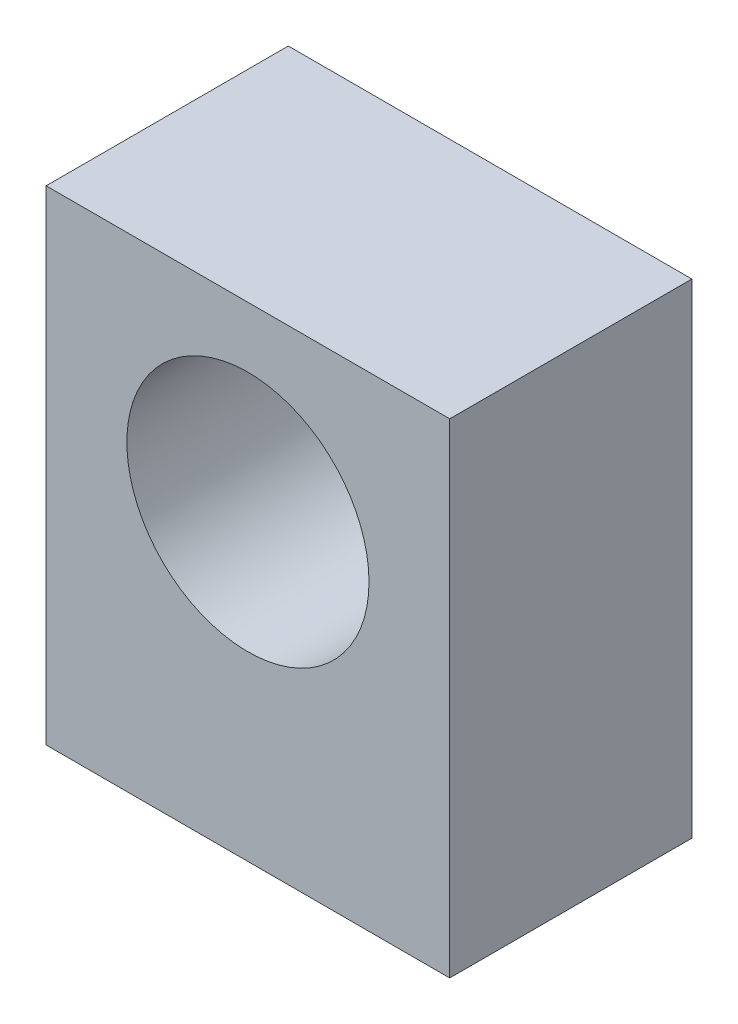
ISO-10303-21;
HEADER;
FILE_DESCRIPTION(('STEP AP214'),'2;1');
FILE_NAME('part.step','',(''),(''),'','','');
FILE_SCHEMA(('AUTOMOTIVE_DESIGN { 1 0 10303 214 1 1 1 1 }'));
ENDSEC;
DATA;
#1=APPLICATION_CONTEXT('core data for automotive mechanical design processes');
#2=APPLICATION_PROTOCOL_DEFINITION('international standard','automotive_design',2000,#1);
#3=PRODUCT_CONTEXT('',#1,'mechanical');
#4=PRODUCT('Part','Part','',(#3));
#5=PRODUCT_RELATED_PRODUCT_CATEGORY('part','',(#4));
#6=PRODUCT_DEFINITION_FORMATION('','',#4);
#7=PRODUCT_DEFINITION_CONTEXT('part definition',#1,'design');
#8=PRODUCT_DEFINITION('design','',#6,#7);
#9=PRODUCT_DEFINITION_SHAPE('','',#8);
#10=(LENGTH_UNIT() NAMED_UNIT(*) SI_UNIT(.MILLI.,.METRE.));
#11=(NAMED_UNIT(*) PLANE_ANGLE_UNIT() SI_UNIT($,.RADIAN.));
#12=(NAMED_UNIT(*) SI_UNIT($,.STERADIAN.) SOLID_ANGLE_UNIT());
#13=UNCERTAINTY_MEASURE_WITH_UNIT(LENGTH_MEASURE(1.E-05),#10,'distance_accuracy_value','');
#14=(GEOMETRIC_REPRESENTATION_CONTEXT(3) GLOBAL_UNCERTAINTY_ASSIGNED_CONTEXT((#13)) GLOBAL_UNIT_ASSIGNED_CONTEXT((#10,
#11,#12)) REPRESENTATION_CONTEXT('',''));
#15=CARTESIAN_POINT('',(0.,0.,0.));
#16=DIRECTION('',(0.,0.,1.));
#17=DIRECTION('',(1.,0.,0.));
#18=AXIS2_PLACEMENT_3D('',#15,#16,#17);
#19=CARTESIAN_POINT('',(15.875,0.,19.05));
#20=DIRECTION('',(-1.,0.,0.));
#21=DIRECTION('',(0.,-1.,0.));
#22=AXIS2_PLACEMENT_3D('',#19,#20,#21);
#23=PLANE('',#22);
#24=DIRECTION('',(0.,1.,0.));
#25=VECTOR('',#24,1.);
#26=CARTESIAN_POINT('',(15.875,0.,0.));
#27=LINE('',#26,#25);
#28=CARTESIAN_POINT('',(15.875,0.,0.));
#29=VERTEX_POINT('',#28);
#30=CARTESIAN_POINT('',(15.875,38.1,0.));
#31=VERTEX_POINT('',#30);
#32=EDGE_CURVE('E99',#29,#31,#27,.T.);
#33=ORIENTED_EDGE('',*,*,#32,.T.);
#34=DIRECTION('',(0.,0.,-1.));
#35=VECTOR('',#34,1.);
#36=CARTESIAN_POINT('',(15.875,38.1,19.05));
#37=LINE('',#36,#35);
#38=CARTESIAN_POINT('',(15.875,38.1,19.05));
#39=VERTEX_POINT('',#38);
#40=EDGE_CURVE('E11',#39,#31,#37,.T.);
#41=ORIENTED_EDGE('',*,*,#40,.F.);
#42=DIRECTION('',(0.,1.,0.));
#43=VECTOR('',#42,1.);
#44=CARTESIAN_POINT('',(15.875,0.,19.05));
#45=LINE('',#44,#43);
#46=CARTESIAN_POINT('',(15.875,0.,19.05));
#47=VERTEX_POINT('',#46);
#48=EDGE_CURVE('E75',#47,#39,#45,.T.);
#49=ORIENTED_EDGE('',*,*,#48,.F.);
#50=DIRECTION('',(0.,0.,-1.));
#51=VECTOR('',#50,1.);
#52=CARTESIAN_POINT('',(15.875,0.,19.05));
#53=LINE('',#52,#51);
#54=EDGE_CURVE('E50',#47,#29,#53,.T.);
#55=ORIENTED_EDGE('',*,*,#54,.T.);
#56=EDGE_LOOP('',(#33,#41,#49,#55));
#57=FACE_BOUND('',#56,.T.);
#58=ADVANCED_FACE('F34',(#57),#23,.F.);
#59=CARTESIAN_POINT('',(-15.875,38.1,19.05));
#60=DIRECTION('',(0.,1.,0.));
#61=DIRECTION('',(0.,0.,1.));
#62=AXIS2_PLACEMENT_3D('',#59,#60,#61);
#63=PLANE('',#62);
#64=DIRECTION('',(1.,0.,0.));
#65=VECTOR('',#64,1.);
#66=CARTESIAN_POINT('',(-15.875,38.1,0.));
#67=LINE('',#66,#65);
#68=CARTESIAN_POINT('',(-15.875,38.1,0.));
#69=VERTEX_POINT('',#68);
#70=EDGE_CURVE('E85',#69,#31,#67,.T.);
#71=ORIENTED_EDGE('',*,*,#70,.F.);
#72=DIRECTION('',(0.,0.,-1.));
#73=VECTOR('',#72,1.);
#74=CARTESIAN_POINT('',(-15.875,38.1,19.05));
#75=LINE('',#74,#73);
#76=CARTESIAN_POINT('',(-15.875,38.1,19.05));
#77=VERTEX_POINT('',#76);
#78=EDGE_CURVE('E42',#77,#69,#75,.T.);
#79=ORIENTED_EDGE('',*,*,#78,.F.);
#80=DIRECTION('',(1.,0.,0.));
#81=VECTOR('',#80,1.);
#82=CARTESIAN_POINT('',(-15.875,38.1,19.05));
#83=LINE('',#82,#81);
#84=EDGE_CURVE('E83',#77,#39,#83,.T.);
#85=ORIENTED_EDGE('',*,*,#84,.T.);
#86=ORIENTED_EDGE('',*,*,#40,.T.);
#87=EDGE_LOOP('',(#71,#79,#85,#86));
#88=FACE_BOUND('',#87,.T.);
#89=ADVANCED_FACE('F82',(#88),#63,.T.);
#90=CARTESIAN_POINT('',(-15.875,38.1,19.05));
#91=DIRECTION('',(1.,0.,0.));
#92=DIRECTION('',(0.,1.,0.));
#93=AXIS2_PLACEMENT_3D('',#90,#91,#92);
#94=PLANE('',#93);
#95=DIRECTION('',(0.,-1.,0.));
#96=VECTOR('',#95,1.);
#97=CARTESIAN_POINT('',(-15.875,38.1,0.));
#98=LINE('',#97,#96);
#99=CARTESIAN_POINT('',(-15.875,0.,0.));
#100=VERTEX_POINT('',#99);
#101=EDGE_CURVE('E103',#69,#100,#98,.T.);
#102=ORIENTED_EDGE('',*,*,#101,.T.);
#103=DIRECTION('',(0.,0.,-1.));
#104=VECTOR('',#103,1.);
#105=CARTESIAN_POINT('',(-15.875,0.,19.05));
#106=LINE('',#105,#104);
#107=CARTESIAN_POINT('',(-15.875,0.,19.05));
#108=VERTEX_POINT('',#107);
#109=EDGE_CURVE('E64',#108,#100,#106,.T.);
#110=ORIENTED_EDGE('',*,*,#109,.F.);
#111=DIRECTION('',(0.,-1.,0.));
#112=VECTOR('',#111,1.);
#113=CARTESIAN_POINT('',(-15.875,38.1,19.05));
#114=LINE('',#113,#112);
#115=EDGE_CURVE('E88',#77,#108,#114,.T.);
#116=ORIENTED_EDGE('',*,*,#115,.F.);
#117=ORIENTED_EDGE('',*,*,#78,.T.);
#118=EDGE_LOOP('',(#102,#110,#116,#117));
#119=FACE_BOUND('',#118,.T.);
#120=ADVANCED_FACE('F89',(#119),#94,.F.);
#121=CARTESIAN_POINT('',(15.875,0.,19.05));
#122=DIRECTION('',(0.,-1.,0.));
#123=DIRECTION('',(1.,0.,0.));
#124=AXIS2_PLACEMENT_3D('',#121,#122,#123);
#125=PLANE('',#124);
#126=DIRECTION('',(-1.,0.,0.));
#127=VECTOR('',#126,1.);
#128=CARTESIAN_POINT('',(15.875,0.,0.));
#129=LINE('',#128,#127);
#130=EDGE_CURVE('E94',#29,#100,#129,.T.);
#131=ORIENTED_EDGE('',*,*,#130,.F.);
#132=ORIENTED_EDGE('',*,*,#54,.F.);
#133=DIRECTION('',(-1.,0.,0.));
#134=VECTOR('',#133,1.);
#135=CARTESIAN_POINT('',(15.875,0.,19.05));
#136=LINE('',#135,#134);
#137=EDGE_CURVE('E90',#47,#108,#136,.T.);
#138=ORIENTED_EDGE('',*,*,#137,.T.);
#139=ORIENTED_EDGE('',*,*,#109,.T.);
#140=EDGE_LOOP('',(#131,#132,#138,#139));
#141=FACE_BOUND('',#140,.T.);
#142=ADVANCED_FACE('F110',(#141),#125,.T.);
#143=CARTESIAN_POINT('',(15.875,38.1,19.05));
#144=DIRECTION('',(0.,0.,-1.));
#145=DIRECTION('',(-1.,0.,0.));
#146=AXIS2_PLACEMENT_3D('',#143,#144,#145);
#147=PLANE('',#146);
#148=CARTESIAN_POINT('',(0.,23.8125,19.05));
#149=DIRECTION('',(0.,0.,1.));
#150=DIRECTION('',(1.,0.,0.));
#151=AXIS2_PLACEMENT_3D('',#148,#149,#150);
#152=CIRCLE('',#151,9.525);
#153=CARTESIAN_POINT('',(9.525,23.8125,19.05));
#154=VERTEX_POINT('',#153);
#155=EDGE_CURVE('E168',#154,#154,#152,.T.);
#156=ORIENTED_EDGE('',*,*,#155,.F.);
#157=EDGE_LOOP('',(#156));
#158=FACE_BOUND('',#157,.T.);
#159=ORIENTED_EDGE('',*,*,#48,.T.);
#160=ORIENTED_EDGE('',*,*,#84,.F.);
#161=ORIENTED_EDGE('',*,*,#115,.T.);
#162=ORIENTED_EDGE('',*,*,#137,.F.);
#163=EDGE_LOOP('',(#159,#160,#161,#162));
#164=FACE_BOUND('',#163,.T.);
#165=ADVANCED_FACE('F92',(#158,#164),#147,.F.);
#166=CARTESIAN_POINT('',(15.875,38.1,0.));
#167=DIRECTION('',(0.,0.,-1.));
#168=DIRECTION('',(-1.,0.,0.));
#169=AXIS2_PLACEMENT_3D('',#166,#167,#168);
#170=PLANE('',#169);
#171=CARTESIAN_POINT('',(0.,23.8125,0.));
#172=DIRECTION('',(0.,0.,1.));
#173=DIRECTION('',(1.,0.,0.));
#174=AXIS2_PLACEMENT_3D('',#171,#172,#173);
#175=CIRCLE('',#174,9.525);
#176=CARTESIAN_POINT('',(9.525,23.8125,0.));
#177=VERTEX_POINT('',#176);
#178=EDGE_CURVE('E101',#177,#177,#175,.T.);
#179=ORIENTED_EDGE('',*,*,#178,.T.);
#180=EDGE_LOOP('',(#179));
#181=FACE_BOUND('',#180,.T.);
#182=ORIENTED_EDGE('',*,*,#32,.F.);
#183=ORIENTED_EDGE('',*,*,#130,.T.);
#184=ORIENTED_EDGE('',*,*,#101,.F.);
#185=ORIENTED_EDGE('',*,*,#70,.T.);
#186=EDGE_LOOP('',(#182,#183,#184,#185));
#187=FACE_BOUND('',#186,.T.);
#188=ADVANCED_FACE('F109',(#181,#187),#170,.T.);
#189=CARTESIAN_POINT('',(0.,23.8125,0.));
#190=DIRECTION('',(0.,0.,1.));
#191=DIRECTION('',(1.,0.,0.));
#192=AXIS2_PLACEMENT_3D('',#189,#190,#191);
#193=CYLINDRICAL_SURFACE('',#192,9.525);
#194=CARTESIAN_POINT('',(9.525,23.8125,0.));
#195=CARTESIAN_POINT('',(9.525,23.8125,0.1984375));
#196=CARTESIAN_POINT('',(9.525,23.8125,0.396875));
#197=CARTESIAN_POINT('',(9.525,23.8125,0.79375));
#198=CARTESIAN_POINT('',(9.525,23.8125,0.9921875));
#199=CARTESIAN_POINT('',(9.525,23.8125,1.3890625));
#200=CARTESIAN_POINT('',(9.525,23.8125,1.5875));
#201=CARTESIAN_POINT('',(9.525,23.8125,1.984375));
#202=CARTESIAN_POINT('',(9.525,23.8125,2.1828125));
#203=CARTESIAN_POINT('',(9.525,23.8125,2.5796875));
#204=CARTESIAN_POINT('',(9.525,23.8125,2.778125));
#205=CARTESIAN_POINT('',(9.525,23.8125,3.175));
#206=CARTESIAN_POINT('',(9.525,23.8125,3.3734375));
#207=CARTESIAN_POINT('',(9.525,23.8125,3.7703125));
#208=CARTESIAN_POINT('',(9.525,23.8125,3.96875));
#209=CARTESIAN_POINT('',(9.525,23.8125,4.365625));
#210=CARTESIAN_POINT('',(9.525,23.8125,4.5640625));
#211=CARTESIAN_POINT('',(9.525,23.8125,4.9609375));
#212=CARTESIAN_POINT('',(9.525,23.8125,5.159375));
#213=CARTESIAN_POINT('',(9.525,23.8125,5.55625));
#214=CARTESIAN_POINT('',(9.525,23.8125,5.7546875));
#215=CARTESIAN_POINT('',(9.525,23.8125,6.1515625));
#216=CARTESIAN_POINT('',(9.525,23.8125,6.35));
#217=CARTESIAN_POINT('',(9.525,23.8125,6.746875));
#218=CARTESIAN_POINT('',(9.525,23.8125,6.9453125));
#219=CARTESIAN_POINT('',(9.525,23.8125,7.3421875));
#220=CARTESIAN_POINT('',(9.525,23.8125,7.540625));
#221=CARTESIAN_POINT('',(9.525,23.8125,7.9375));
#222=CARTESIAN_POINT('',(9.525,23.8125,8.1359375));
#223=CARTESIAN_POINT('',(9.525,23.8125,8.5328125));
#224=CARTESIAN_POINT('',(9.525,23.8125,8.73125));
#225=CARTESIAN_POINT('',(9.525,23.8125,9.128125));
#226=CARTESIAN_POINT('',(9.525,23.8125,9.3265625));
#227=CARTESIAN_POINT('',(9.525,23.8125,9.7234375));
#228=CARTESIAN_POINT('',(9.525,23.8125,9.921875));
#229=CARTESIAN_POINT('',(9.525,23.8125,10.31875));
#230=CARTESIAN_POINT('',(9.525,23.8125,10.5171875));
#231=CARTESIAN_POINT('',(9.525,23.8125,10.9140625));
#232=CARTESIAN_POINT('',(9.525,23.8125,11.1125));
#233=CARTESIAN_POINT('',(9.525,23.8125,11.509375));
#234=CARTESIAN_POINT('',(9.525,23.8125,11.7078125));
#235=CARTESIAN_POINT('',(9.525,23.8125,12.1046875));
#236=CARTESIAN_POINT('',(9.525,23.8125,12.303125));
#237=CARTESIAN_POINT('',(9.525,23.8125,12.7));
#238=CARTESIAN_POINT('',(9.525,23.8125,12.8984375));
#239=CARTESIAN_POINT('',(9.525,23.8125,13.2953125));
#240=CARTESIAN_POINT('',(9.525,23.8125,13.49375));
#241=CARTESIAN_POINT('',(9.525,23.8125,13.890625));
#242=CARTESIAN_POINT('',(9.525,23.8125,14.0890625));
#243=CARTESIAN_POINT('',(9.525,23.8125,14.4859375));
#244=CARTESIAN_POINT('',(9.525,23.8125,14.684375));
#245=CARTESIAN_POINT('',(9.525,23.8125,15.08125));
#246=CARTESIAN_POINT('',(9.525,23.8125,15.2796875));
#247=CARTESIAN_POINT('',(9.525,23.8125,15.6765625));
#248=CARTESIAN_POINT('',(9.525,23.8125,15.875));
#249=CARTESIAN_POINT('',(9.525,23.8125,16.271875));
#250=CARTESIAN_POINT('',(9.525,23.8125,16.4703125));
#251=CARTESIAN_POINT('',(9.525,23.8125,16.8671875));
#252=CARTESIAN_POINT('',(9.525,23.8125,17.065625));
#253=CARTESIAN_POINT('',(9.525,23.8125,17.4625));
#254=CARTESIAN_POINT('',(9.525,23.8125,17.6609375));
#255=CARTESIAN_POINT('',(9.525,23.8125,18.0578125));
#256=CARTESIAN_POINT('',(9.525,23.8125,18.25625));
#257=CARTESIAN_POINT('',(9.525,23.8125,18.653125));
#258=CARTESIAN_POINT('',(9.525,23.8125,18.8515625));
#259=CARTESIAN_POINT('',(9.525,23.8125,19.05));
#260=B_SPLINE_CURVE_WITH_KNOTS('',3,(#194,#195,#196,#197,#198,#199,#200,#201,#202,#203,#204,
#205,#206,#207,#208,#209,#210,#211,#212,#213,#214,#215,#216,#217,#218,#219,#220,#221,#222,#223,
#224,#225,#226,#227,#228,#229,#230,#231,#232,#233,#234,#235,#236,#237,#238,#239,#240,#241,#242,
#243,#244,#245,#246,#247,#248,#249,#250,#251,#252,#253,#254,#255,#256,#257,#258,#259),
.UNSPECIFIED.,.F.,.F.,(4,2,2,2,2,2,2,2,2,2,2,2,2,2,2,2,2,2,2,2,2,2,2,2,2,2,2,2,2,2,2,2,4),(0.,
0.5953125,1.190625,1.7859375,2.38125,2.9765625,3.571875,4.1671875,4.7625,5.3578125,5.953125,
6.5484375,7.14375,7.7390625,8.334375,8.9296875,9.525,10.1203125,10.715625,11.3109375,11.90625,
12.5015625,13.096875,13.6921875,14.2875,14.8828125,15.478125,16.0734375,16.66875,17.2640625,
17.859375,18.4546875,19.05),.UNSPECIFIED.);
#261=EDGE_CURVE('BSEAM150',#177,#154,#260,.T.);
#262=ORIENTED_EDGE('',*,*,#178,.F.);
#263=ORIENTED_EDGE('',*,*,#155,.T.);
#264=ORIENTED_EDGE('',*,*,#261,.T.);
#265=ORIENTED_EDGE('',*,*,#261,.F.);
#266=EDGE_LOOP('',(#262,#264,#263,#265));
#267=FACE_BOUND('',#266,.T.);
#268=ADVANCED_FACE('F150',(#267),#193,.F.);
#269=CLOSED_SHELL('',(#58,#89,#120,#142,#165,#188,#268));
#270=MANIFOLD_SOLID_BREP('B2',#269);
#271=ADVANCED_BREP_SHAPE_REPRESENTATION('',(#18,#270),#14);
#272=SHAPE_DEFINITION_REPRESENTATION(#9,#271);
ENDSEC;
END-ISO-10303-21;
